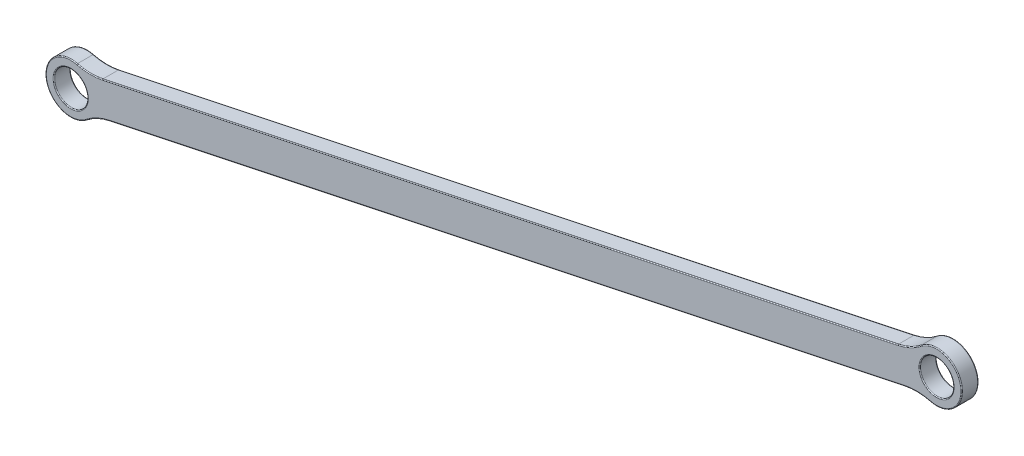
ISO-10303-21;
HEADER;
FILE_DESCRIPTION(('STEP AP214'),'2;1');
FILE_NAME('part.step','',(''),(''),'','','');
FILE_SCHEMA(('AUTOMOTIVE_DESIGN { 1 0 10303 214 1 1 1 1 }'));
ENDSEC;
DATA;
#1=APPLICATION_CONTEXT('core data for automotive mechanical design processes');
#2=APPLICATION_PROTOCOL_DEFINITION('international standard','automotive_design',2000,#1);
#3=PRODUCT_CONTEXT('',#1,'mechanical');
#4=PRODUCT('Part','Part','',(#3));
#5=PRODUCT_RELATED_PRODUCT_CATEGORY('part','',(#4));
#6=PRODUCT_DEFINITION_FORMATION('','',#4);
#7=PRODUCT_DEFINITION_CONTEXT('part definition',#1,'design');
#8=PRODUCT_DEFINITION('design','',#6,#7);
#9=PRODUCT_DEFINITION_SHAPE('','',#8);
#10=(LENGTH_UNIT() NAMED_UNIT(*) SI_UNIT(.MILLI.,.METRE.));
#11=(NAMED_UNIT(*) PLANE_ANGLE_UNIT() SI_UNIT($,.RADIAN.));
#12=(NAMED_UNIT(*) SI_UNIT($,.STERADIAN.) SOLID_ANGLE_UNIT());
#13=UNCERTAINTY_MEASURE_WITH_UNIT(LENGTH_MEASURE(1.E-05),#10,'distance_accuracy_value','');
#14=(GEOMETRIC_REPRESENTATION_CONTEXT(3) GLOBAL_UNCERTAINTY_ASSIGNED_CONTEXT((#13)) GLOBAL_UNIT_ASSIGNED_CONTEXT((#10,
#11,#12)) REPRESENTATION_CONTEXT('',''));
#15=CARTESIAN_POINT('',(0.,0.,0.));
#16=DIRECTION('',(0.,0.,1.));
#17=DIRECTION('',(1.,0.,0.));
#18=AXIS2_PLACEMENT_3D('',#15,#16,#17);
#19=CARTESIAN_POINT('',(-210.455221734671,197.142632271964,-3.));
#20=DIRECTION('',(0.,0.,1.));
#21=DIRECTION('',(1.,0.,0.));
#22=AXIS2_PLACEMENT_3D('',#19,#20,#21);
#23=CYLINDRICAL_SURFACE('',#22,4.49999999999999);
#24=DIRECTION('',(0.,0.,1.));
#25=VECTOR('',#24,1.);
#26=CARTESIAN_POINT('',(-209.338930800535,201.50197792818,-3.));
#27=LINE('',#26,#25);
#28=CARTESIAN_POINT('',(-209.338930800535,201.50197792818,-0.15));
#29=VERTEX_POINT('',#28);
#30=CARTESIAN_POINT('',(-209.338930800535,201.50197792818,-2.85));
#31=VERTEX_POINT('',#30);
#32=EDGE_CURVE('E306',#29,#31,#27,.F.);
#33=ORIENTED_EDGE('',*,*,#32,.T.);
#34=CARTESIAN_POINT('',(-210.455221734671,197.142632271964,-2.85));
#35=DIRECTION('',(0.,0.,1.));
#36=DIRECTION('',(1.,0.,0.));
#37=AXIS2_PLACEMENT_3D('',#34,#35,#36);
#38=CIRCLE('',#37,4.49999999999999);
#39=CARTESIAN_POINT('',(-207.671143978915,193.607252370185,-2.85));
#40=VERTEX_POINT('',#39);
#41=EDGE_CURVE('E221',#31,#40,#38,.T.);
#42=ORIENTED_EDGE('',*,*,#41,.T.);
#43=DIRECTION('',(0.,0.,1.));
#44=VECTOR('',#43,1.);
#45=CARTESIAN_POINT('',(-207.671143978915,193.607252370185,-3.));
#46=LINE('',#45,#44);
#47=CARTESIAN_POINT('',(-207.671143978915,193.607252370185,-0.15));
#48=VERTEX_POINT('',#47);
#49=EDGE_CURVE('E300',#40,#48,#46,.T.);
#50=ORIENTED_EDGE('',*,*,#49,.T.);
#51=CARTESIAN_POINT('',(-210.455221734671,197.142632271964,-0.15));
#52=DIRECTION('',(0.,0.,1.));
#53=DIRECTION('',(1.,0.,0.));
#54=AXIS2_PLACEMENT_3D('',#51,#52,#53);
#55=CIRCLE('',#54,4.49999999999999);
#56=EDGE_CURVE('E219',#48,#29,#55,.F.);
#57=ORIENTED_EDGE('',*,*,#56,.T.);
#58=EDGE_LOOP('',(#33,#42,#50,#57));
#59=FACE_BOUND('',#58,.T.);
#60=ADVANCED_FACE('F35',(#59),#23,.T.);
#61=CARTESIAN_POINT('',(-49.4788263297098,234.215638198508,-3.));
#62=DIRECTION('',(0.206691529175114,-0.978406158896832,0.));
#63=DIRECTION('',(0.978406158896832,0.206691529175114,0.));
#64=AXIS2_PLACEMENT_3D('',#61,#62,#63);
#65=PLANE('',#64);
#66=DIRECTION('',(0.,0.,1.));
#67=VECTOR('',#66,1.);
#68=CARTESIAN_POINT('',(-62.5965873535892,231.444467902078,-3.));
#69=LINE('',#68,#67);
#70=CARTESIAN_POINT('',(-62.5965873535892,231.444467902078,-0.15));
#71=VERTEX_POINT('',#70);
#72=CARTESIAN_POINT('',(-62.5965873535892,231.444467902078,-2.85));
#73=VERTEX_POINT('',#72);
#74=EDGE_CURVE('E334',#71,#73,#69,.F.);
#75=ORIENTED_EDGE('',*,*,#74,.T.);
#76=DIRECTION('',(0.978406158896832,0.206691529175114,0.));
#77=VECTOR('',#76,1.);
#78=CARTESIAN_POINT('',(-49.4788263297098,234.215638198508,-2.85));
#79=LINE('',#78,#77);
#80=CARTESIAN_POINT('',(-204.791368988482,201.405351130802,-2.85));
#81=VERTEX_POINT('',#80);
#82=EDGE_CURVE('E213',#73,#81,#79,.F.);
#83=ORIENTED_EDGE('',*,*,#82,.T.);
#84=DIRECTION('',(0.,0.,1.));
#85=VECTOR('',#84,1.);
#86=CARTESIAN_POINT('',(-204.791368988482,201.405351130802,-3.));
#87=LINE('',#86,#85);
#88=CARTESIAN_POINT('',(-204.791368988482,201.405351130802,-0.15));
#89=VERTEX_POINT('',#88);
#90=EDGE_CURVE('E337',#81,#89,#87,.T.);
#91=ORIENTED_EDGE('',*,*,#90,.T.);
#92=DIRECTION('',(0.978406158896832,0.206691529175114,0.));
#93=VECTOR('',#92,1.);
#94=CARTESIAN_POINT('',(-62.5965873535892,231.444467902078,-0.15));
#95=LINE('',#94,#93);
#96=EDGE_CURVE('E211',#89,#71,#95,.T.);
#97=ORIENTED_EDGE('',*,*,#96,.T.);
#98=EDGE_LOOP('',(#75,#83,#91,#97));
#99=FACE_BOUND('',#98,.T.);
#100=ADVANCED_FACE('F368',(#99),#65,.F.);
#101=CARTESIAN_POINT('',(-55.6925854323498,229.836749807534,-3.));
#102=DIRECTION('',(0.,0.,1.));
#103=DIRECTION('',(1.,0.,0.));
#104=AXIS2_PLACEMENT_3D('',#101,#102,#103);
#105=CYLINDRICAL_SURFACE('',#104,4.5);
#106=DIRECTION('',(0.,0.,1.));
#107=VECTOR('',#106,1.);
#108=CARTESIAN_POINT('',(-56.8088763664856,225.477404151319,-3.));
#109=LINE('',#108,#107);
#110=CARTESIAN_POINT('',(-56.8088763664856,225.477404151319,-0.15));
#111=VERTEX_POINT('',#110);
#112=CARTESIAN_POINT('',(-56.8088763664856,225.477404151319,-2.85));
#113=VERTEX_POINT('',#112);
#114=EDGE_CURVE('E262',#111,#113,#109,.F.);
#115=ORIENTED_EDGE('',*,*,#114,.T.);
#116=CARTESIAN_POINT('',(-55.6925854323498,229.836749807534,-2.85));
#117=DIRECTION('',(0.,0.,1.));
#118=DIRECTION('',(1.,0.,0.));
#119=AXIS2_PLACEMENT_3D('',#116,#117,#118);
#120=CIRCLE('',#119,4.5);
#121=CARTESIAN_POINT('',(-58.4766631881055,233.372129709314,-2.85));
#122=VERTEX_POINT('',#121);
#123=EDGE_CURVE('E204',#113,#122,#120,.T.);
#124=ORIENTED_EDGE('',*,*,#123,.T.);
#125=DIRECTION('',(0.,0.,1.));
#126=VECTOR('',#125,1.);
#127=CARTESIAN_POINT('',(-58.4766631881055,233.372129709314,-3.));
#128=LINE('',#127,#126);
#129=CARTESIAN_POINT('',(-58.4766631881055,233.372129709314,-0.15));
#130=VERTEX_POINT('',#129);
#131=EDGE_CURVE('E342',#122,#130,#128,.T.);
#132=ORIENTED_EDGE('',*,*,#131,.T.);
#133=CARTESIAN_POINT('',(-55.6925854323498,229.836749807534,-0.15));
#134=DIRECTION('',(0.,0.,1.));
#135=DIRECTION('',(1.,0.,0.));
#136=AXIS2_PLACEMENT_3D('',#133,#134,#135);
#137=CIRCLE('',#136,4.5);
#138=EDGE_CURVE('E202',#130,#111,#137,.F.);
#139=ORIENTED_EDGE('',*,*,#138,.T.);
#140=EDGE_LOOP('',(#115,#124,#132,#139));
#141=FACE_BOUND('',#140,.T.);
#142=ADVANCED_FACE('F349',(#141),#105,.T.);
#143=CARTESIAN_POINT('',(-48.2386771546591,228.345201245127,-3.));
#144=DIRECTION('',(0.206691529175114,-0.978406158896832,0.));
#145=DIRECTION('',(0.978406158896832,0.206691529175114,0.));
#146=AXIS2_PLACEMENT_3D('',#143,#144,#145);
#147=PLANE('',#146);
#148=DIRECTION('',(0.,0.,-1.));
#149=VECTOR('',#148,1.);
#150=CARTESIAN_POINT('',(-203.551219813431,195.534914177421,-3.));
#151=LINE('',#150,#149);
#152=CARTESIAN_POINT('',(-203.551219813431,195.534914177421,-0.15));
#153=VERTEX_POINT('',#152);
#154=CARTESIAN_POINT('',(-203.551219813431,195.534914177421,-2.85));
#155=VERTEX_POINT('',#154);
#156=EDGE_CURVE('E302',#153,#155,#151,.T.);
#157=ORIENTED_EDGE('',*,*,#156,.T.);
#158=DIRECTION('',(0.978406158896832,0.206691529175114,0.));
#159=VECTOR('',#158,1.);
#160=CARTESIAN_POINT('',(-61.3564381785385,225.574030948697,-2.85));
#161=LINE('',#160,#159);
#162=CARTESIAN_POINT('',(-61.3564381785385,225.574030948697,-2.85));
#163=VERTEX_POINT('',#162);
#164=EDGE_CURVE('E196',#155,#163,#161,.T.);
#165=ORIENTED_EDGE('',*,*,#164,.T.);
#166=DIRECTION('',(0.,0.,-1.));
#167=VECTOR('',#166,1.);
#168=CARTESIAN_POINT('',(-61.3564381785385,225.574030948697,0.));
#169=LINE('',#168,#167);
#170=CARTESIAN_POINT('',(-61.3564381785385,225.574030948697,-0.15));
#171=VERTEX_POINT('',#170);
#172=EDGE_CURVE('E310',#163,#171,#169,.F.);
#173=ORIENTED_EDGE('',*,*,#172,.T.);
#174=DIRECTION('',(0.978406158896832,0.206691529175114,0.));
#175=VECTOR('',#174,1.);
#176=CARTESIAN_POINT('',(-48.2386771546591,228.345201245127,-0.15));
#177=LINE('',#176,#175);
#178=EDGE_CURVE('E194',#171,#153,#177,.F.);
#179=ORIENTED_EDGE('',*,*,#178,.T.);
#180=EDGE_LOOP('',(#157,#165,#173,#179));
#181=FACE_BOUND('',#180,.T.);
#182=ADVANCED_FACE('F333',(#181),#147,.T.);
#183=CARTESIAN_POINT('',(-55.6925854323498,229.836749807534,-3.));
#184=DIRECTION('',(0.,0.,1.));
#185=DIRECTION('',(1.,0.,0.));
#186=AXIS2_PLACEMENT_3D('',#183,#184,#185);
#187=CYLINDRICAL_SURFACE('',#186,3.00000000000002);
#188=CARTESIAN_POINT('',(-55.6925854323498,229.836749807534,-2.85));
#189=DIRECTION('',(0.,0.,1.));
#190=DIRECTION('',(1.,0.,0.));
#191=AXIS2_PLACEMENT_3D('',#188,#189,#190);
#192=CIRCLE('',#191,3.00000000000002);
#193=CARTESIAN_POINT('',(-52.6925854323498,229.836749807534,-2.85));
#194=VERTEX_POINT('',#193);
#195=EDGE_CURVE('E226',#194,#194,#192,.F.);
#196=ORIENTED_EDGE('',*,*,#195,.T.);
#197=EDGE_LOOP('',(#196));
#198=FACE_BOUND('',#197,.T.);
#199=CARTESIAN_POINT('',(-55.6925854323498,229.836749807534,-0.15));
#200=DIRECTION('',(0.,0.,1.));
#201=DIRECTION('',(1.,0.,0.));
#202=AXIS2_PLACEMENT_3D('',#199,#200,#201);
#203=CIRCLE('',#202,3.00000000000002);
#204=CARTESIAN_POINT('',(-52.6925854323498,229.836749807534,-0.15));
#205=VERTEX_POINT('',#204);
#206=EDGE_CURVE('E223',#205,#205,#203,.T.);
#207=ORIENTED_EDGE('',*,*,#206,.T.);
#208=EDGE_LOOP('',(#207));
#209=FACE_BOUND('',#208,.T.);
#210=ADVANCED_FACE('F403',(#198,#209),#187,.F.);
#211=CARTESIAN_POINT('',(-210.455221734671,197.142632271964,-3.));
#212=DIRECTION('',(0.,0.,1.));
#213=DIRECTION('',(1.,0.,0.));
#214=AXIS2_PLACEMENT_3D('',#211,#212,#213);
#215=CYLINDRICAL_SURFACE('',#214,3.00000000000001);
#216=CARTESIAN_POINT('',(-210.455221734671,197.142632271964,-2.85));
#217=DIRECTION('',(0.,0.,1.));
#218=DIRECTION('',(1.,0.,0.));
#219=AXIS2_PLACEMENT_3D('',#216,#217,#218);
#220=CIRCLE('',#219,3.00000000000001);
#221=CARTESIAN_POINT('',(-207.455221734671,197.142632271964,-2.85));
#222=VERTEX_POINT('',#221);
#223=EDGE_CURVE('E188',#222,#222,#220,.F.);
#224=ORIENTED_EDGE('',*,*,#223,.T.);
#225=EDGE_LOOP('',(#224));
#226=FACE_BOUND('',#225,.T.);
#227=CARTESIAN_POINT('',(-210.455221734671,197.142632271964,-0.15));
#228=DIRECTION('',(0.,0.,1.));
#229=DIRECTION('',(1.,0.,0.));
#230=AXIS2_PLACEMENT_3D('',#227,#228,#229);
#231=CIRCLE('',#230,3.00000000000001);
#232=CARTESIAN_POINT('',(-207.455221734671,197.142632271964,-0.15));
#233=VERTEX_POINT('',#232);
#234=EDGE_CURVE('E180',#233,#233,#231,.T.);
#235=ORIENTED_EDGE('',*,*,#234,.T.);
#236=EDGE_LOOP('',(#235));
#237=FACE_BOUND('',#236,.T.);
#238=ADVANCED_FACE('F405',(#226,#237),#215,.F.);
#239=CARTESIAN_POINT('',(0.,0.,-3.));
#240=DIRECTION('',(0.,0.,1.));
#241=DIRECTION('',(1.,0.,0.));
#242=AXIS2_PLACEMENT_3D('',#239,#240,#241);
#243=PLANE('',#242);
#244=CARTESIAN_POINT('',(-210.455221734671,197.142632271964,-3.));
#245=DIRECTION('',(0.,0.,1.));
#246=DIRECTION('',(1.,0.,0.));
#247=AXIS2_PLACEMENT_3D('',#244,#245,#246);
#248=CIRCLE('',#247,3.15000000000001);
#249=CARTESIAN_POINT('',(-207.305221734671,197.142632271964,-3.));
#250=VERTEX_POINT('',#249);
#251=EDGE_CURVE('E177',#250,#250,#248,.T.);
#252=ORIENTED_EDGE('',*,*,#251,.T.);
#253=EDGE_LOOP('',(#252));
#254=FACE_BOUND('',#253,.T.);
#255=DIRECTION('',(0.978406158896832,0.206691529175114,0.));
#256=VECTOR('',#255,1.);
#257=CARTESIAN_POINT('',(-203.582223542808,195.681675101256,-3.));
#258=LINE('',#257,#256);
#259=CARTESIAN_POINT('',(-61.3874419079148,225.720791872531,-3.));
#260=VERTEX_POINT('',#259);
#261=CARTESIAN_POINT('',(-203.582223542808,195.681675101256,-3.));
#262=VERTEX_POINT('',#261);
#263=EDGE_CURVE('E175',#260,#262,#258,.F.);
#264=ORIENTED_EDGE('',*,*,#263,.T.);
#265=CARTESIAN_POINT('',(-201.48430452168,185.750852588453,-3.));
#266=DIRECTION('',(0.,0.,1.));
#267=DIRECTION('',(1.,0.,0.));
#268=AXIS2_PLACEMENT_3D('',#265,#266,#267);
#269=CIRCLE('',#268,10.15);
#270=CARTESIAN_POINT('',(-207.763946570774,193.725098366911,-3.));
#271=VERTEX_POINT('',#270);
#272=EDGE_CURVE('E155',#262,#271,#269,.T.);
#273=ORIENTED_EDGE('',*,*,#272,.T.);
#274=CARTESIAN_POINT('',(-210.455221734671,197.142632271964,-3.));
#275=DIRECTION('',(0.,0.,1.));
#276=DIRECTION('',(1.,0.,0.));
#277=AXIS2_PLACEMENT_3D('',#274,#275,#276);
#278=CIRCLE('',#277,4.34999999999999);
#279=CARTESIAN_POINT('',(-209.37614049834,201.356666406306,-3.));
#280=VERTEX_POINT('',#279);
#281=EDGE_CURVE('E163',#271,#280,#278,.F.);
#282=ORIENTED_EDGE('',*,*,#281,.T.);
#283=CARTESIAN_POINT('',(-206.858284280233,211.18941271977,-3.));
#284=DIRECTION('',(0.,0.,1.));
#285=DIRECTION('',(1.,0.,0.));
#286=AXIS2_PLACEMENT_3D('',#283,#284,#285);
#287=CIRCLE('',#286,10.15);
#288=CARTESIAN_POINT('',(-204.760365259106,201.258590206967,-3.));
#289=VERTEX_POINT('',#288);
#290=EDGE_CURVE('E169',#280,#289,#287,.T.);
#291=ORIENTED_EDGE('',*,*,#290,.T.);
#292=DIRECTION('',(0.978406158896832,0.206691529175114,0.));
#293=VECTOR('',#292,1.);
#294=CARTESIAN_POINT('',(-49.4478226003336,234.068877274674,-3.));
#295=LINE('',#294,#293);
#296=CARTESIAN_POINT('',(-62.565583624213,231.297706978243,-3.));
#297=VERTEX_POINT('',#296);
#298=EDGE_CURVE('E315',#289,#297,#295,.T.);
#299=ORIENTED_EDGE('',*,*,#298,.T.);
#300=CARTESIAN_POINT('',(-64.6635026453404,241.228529491046,-3.));
#301=DIRECTION('',(0.,0.,1.));
#302=DIRECTION('',(1.,0.,0.));
#303=AXIS2_PLACEMENT_3D('',#300,#301,#302);
#304=CIRCLE('',#303,10.15);
#305=CARTESIAN_POINT('',(-58.383860596247,233.254283712588,-3.));
#306=VERTEX_POINT('',#305);
#307=EDGE_CURVE('E317',#297,#306,#304,.T.);
#308=ORIENTED_EDGE('',*,*,#307,.T.);
#309=CARTESIAN_POINT('',(-55.6925854323498,229.836749807534,-3.));
#310=DIRECTION('',(0.,0.,1.));
#311=DIRECTION('',(1.,0.,0.));
#312=AXIS2_PLACEMENT_3D('',#309,#310,#311);
#313=CIRCLE('',#312,4.35);
#314=CARTESIAN_POINT('',(-56.7716666686811,225.622715673193,-3.));
#315=VERTEX_POINT('',#314);
#316=EDGE_CURVE('E319',#306,#315,#313,.F.);
#317=ORIENTED_EDGE('',*,*,#316,.T.);
#318=CARTESIAN_POINT('',(-59.2895228867874,215.789969359729,-3.));
#319=DIRECTION('',(0.,0.,1.));
#320=DIRECTION('',(1.,0.,0.));
#321=AXIS2_PLACEMENT_3D('',#318,#319,#320);
#322=CIRCLE('',#321,10.15);
#323=EDGE_CURVE('E182',#315,#260,#322,.T.);
#324=ORIENTED_EDGE('',*,*,#323,.T.);
#325=EDGE_LOOP('',(#264,#273,#282,#291,#299,#308,#317,#324));
#326=FACE_BOUND('',#325,.T.);
#327=CARTESIAN_POINT('',(-55.6925854323498,229.836749807534,-3.));
#328=DIRECTION('',(0.,0.,1.));
#329=DIRECTION('',(1.,0.,0.));
#330=AXIS2_PLACEMENT_3D('',#327,#328,#329);
#331=CIRCLE('',#330,3.15000000000002);
#332=CARTESIAN_POINT('',(-52.5425854323498,229.836749807534,-3.));
#333=VERTEX_POINT('',#332);
#334=EDGE_CURVE('E170',#333,#333,#331,.T.);
#335=ORIENTED_EDGE('',*,*,#334,.T.);
#336=EDGE_LOOP('',(#335));
#337=FACE_BOUND('',#336,.T.);
#338=ADVANCED_FACE('F172',(#254,#326,#337),#243,.F.);
#339=CARTESIAN_POINT('',(0.,0.,0.));
#340=DIRECTION('',(0.,0.,1.));
#341=DIRECTION('',(1.,0.,0.));
#342=AXIS2_PLACEMENT_3D('',#339,#340,#341);
#343=PLANE('',#342);
#344=CARTESIAN_POINT('',(-210.455221734671,197.142632271964,0.));
#345=DIRECTION('',(0.,0.,1.));
#346=DIRECTION('',(1.,0.,0.));
#347=AXIS2_PLACEMENT_3D('',#344,#345,#346);
#348=CIRCLE('',#347,3.15000000000001);
#349=CARTESIAN_POINT('',(-207.305221734671,197.142632271964,0.));
#350=VERTEX_POINT('',#349);
#351=EDGE_CURVE('E11',#350,#350,#348,.F.);
#352=ORIENTED_EDGE('',*,*,#351,.T.);
#353=EDGE_LOOP('',(#352));
#354=FACE_BOUND('',#353,.T.);
#355=CARTESIAN_POINT('',(-55.6925854323498,229.836749807534,0.));
#356=DIRECTION('',(0.,0.,1.));
#357=DIRECTION('',(1.,0.,0.));
#358=AXIS2_PLACEMENT_3D('',#355,#356,#357);
#359=CIRCLE('',#358,4.35);
#360=CARTESIAN_POINT('',(-56.7716666686811,225.622715673193,0.));
#361=VERTEX_POINT('',#360);
#362=CARTESIAN_POINT('',(-58.383860596247,233.254283712588,0.));
#363=VERTEX_POINT('',#362);
#364=EDGE_CURVE('E52',#361,#363,#359,.T.);
#365=ORIENTED_EDGE('',*,*,#364,.T.);
#366=CARTESIAN_POINT('',(-64.6635026453404,241.228529491046,0.));
#367=DIRECTION('',(0.,0.,1.));
#368=DIRECTION('',(1.,0.,0.));
#369=AXIS2_PLACEMENT_3D('',#366,#367,#368);
#370=CIRCLE('',#369,10.15);
#371=CARTESIAN_POINT('',(-62.565583624213,231.297706978243,0.));
#372=VERTEX_POINT('',#371);
#373=EDGE_CURVE('E44',#363,#372,#370,.F.);
#374=ORIENTED_EDGE('',*,*,#373,.T.);
#375=DIRECTION('',(0.978406158896832,0.206691529175114,0.));
#376=VECTOR('',#375,1.);
#377=CARTESIAN_POINT('',(-204.760365259106,201.258590206967,0.));
#378=LINE('',#377,#376);
#379=CARTESIAN_POINT('',(-204.760365259106,201.258590206967,0.));
#380=VERTEX_POINT('',#379);
#381=EDGE_CURVE('E232',#372,#380,#378,.F.);
#382=ORIENTED_EDGE('',*,*,#381,.T.);
#383=CARTESIAN_POINT('',(-206.858284280233,211.18941271977,0.));
#384=DIRECTION('',(0.,0.,1.));
#385=DIRECTION('',(1.,0.,0.));
#386=AXIS2_PLACEMENT_3D('',#383,#384,#385);
#387=CIRCLE('',#386,10.15);
#388=CARTESIAN_POINT('',(-209.37614049834,201.356666406306,0.));
#389=VERTEX_POINT('',#388);
#390=EDGE_CURVE('E234',#380,#389,#387,.F.);
#391=ORIENTED_EDGE('',*,*,#390,.T.);
#392=CARTESIAN_POINT('',(-210.455221734671,197.142632271964,0.));
#393=DIRECTION('',(0.,0.,1.));
#394=DIRECTION('',(1.,0.,0.));
#395=AXIS2_PLACEMENT_3D('',#392,#393,#394);
#396=CIRCLE('',#395,4.34999999999999);
#397=CARTESIAN_POINT('',(-207.763946570774,193.725098366911,0.));
#398=VERTEX_POINT('',#397);
#399=EDGE_CURVE('E236',#389,#398,#396,.T.);
#400=ORIENTED_EDGE('',*,*,#399,.T.);
#401=CARTESIAN_POINT('',(-201.48430452168,185.750852588453,0.));
#402=DIRECTION('',(0.,0.,1.));
#403=DIRECTION('',(1.,0.,0.));
#404=AXIS2_PLACEMENT_3D('',#401,#402,#403);
#405=CIRCLE('',#404,10.15);
#406=CARTESIAN_POINT('',(-203.582223542808,195.681675101256,0.));
#407=VERTEX_POINT('',#406);
#408=EDGE_CURVE('E238',#398,#407,#405,.F.);
#409=ORIENTED_EDGE('',*,*,#408,.T.);
#410=DIRECTION('',(0.978406158896832,0.206691529175114,0.));
#411=VECTOR('',#410,1.);
#412=CARTESIAN_POINT('',(-48.2696808840354,228.491962168962,0.));
#413=LINE('',#412,#411);
#414=CARTESIAN_POINT('',(-61.3874419079148,225.720791872531,0.));
#415=VERTEX_POINT('',#414);
#416=EDGE_CURVE('E240',#407,#415,#413,.T.);
#417=ORIENTED_EDGE('',*,*,#416,.T.);
#418=CARTESIAN_POINT('',(-59.2895228867874,215.789969359729,0.));
#419=DIRECTION('',(0.,0.,1.));
#420=DIRECTION('',(1.,0.,0.));
#421=AXIS2_PLACEMENT_3D('',#418,#419,#420);
#422=CIRCLE('',#421,10.15);
#423=EDGE_CURVE('E57',#415,#361,#422,.F.);
#424=ORIENTED_EDGE('',*,*,#423,.T.);
#425=EDGE_LOOP('',(#365,#374,#382,#391,#400,#409,#417,#424));
#426=FACE_BOUND('',#425,.T.);
#427=CARTESIAN_POINT('',(-55.6925854323498,229.836749807534,0.));
#428=DIRECTION('',(0.,0.,1.));
#429=DIRECTION('',(1.,0.,0.));
#430=AXIS2_PLACEMENT_3D('',#427,#428,#429);
#431=CIRCLE('',#430,3.15000000000002);
#432=CARTESIAN_POINT('',(-52.5425854323498,229.836749807534,0.));
#433=VERTEX_POINT('',#432);
#434=EDGE_CURVE('E229',#433,#433,#431,.F.);
#435=ORIENTED_EDGE('',*,*,#434,.T.);
#436=EDGE_LOOP('',(#435));
#437=FACE_BOUND('',#436,.T.);
#438=ADVANCED_FACE('F392',(#354,#426,#437),#343,.T.);
#439=CARTESIAN_POINT('',(-64.6635026453404,241.228529491046,-3.));
#440=DIRECTION('',(0.,0.,1.));
#441=DIRECTION('',(1.,0.,0.));
#442=AXIS2_PLACEMENT_3D('',#439,#440,#441);
#443=CYLINDRICAL_SURFACE('',#442,10.);
#444=ORIENTED_EDGE('',*,*,#131,.F.);
#445=CARTESIAN_POINT('',(-64.6635026453404,241.228529491046,-2.85));
#446=DIRECTION('',(0.,0.,1.));
#447=DIRECTION('',(1.,0.,0.));
#448=AXIS2_PLACEMENT_3D('',#445,#446,#447);
#449=CIRCLE('',#448,10.);
#450=EDGE_CURVE('E209',#122,#73,#449,.F.);
#451=ORIENTED_EDGE('',*,*,#450,.T.);
#452=ORIENTED_EDGE('',*,*,#74,.F.);
#453=CARTESIAN_POINT('',(-64.6635026453404,241.228529491046,-0.15));
#454=DIRECTION('',(0.,0.,1.));
#455=DIRECTION('',(1.,0.,0.));
#456=AXIS2_PLACEMENT_3D('',#453,#454,#455);
#457=CIRCLE('',#456,10.);
#458=EDGE_CURVE('E206',#71,#130,#457,.T.);
#459=ORIENTED_EDGE('',*,*,#458,.T.);
#460=EDGE_LOOP('',(#444,#451,#452,#459));
#461=FACE_BOUND('',#460,.T.);
#462=ADVANCED_FACE('F365',(#461),#443,.F.);
#463=CARTESIAN_POINT('',(-59.2895228867874,215.789969359729,-3.));
#464=DIRECTION('',(0.,0.,1.));
#465=DIRECTION('',(1.,0.,0.));
#466=AXIS2_PLACEMENT_3D('',#463,#464,#465);
#467=CYLINDRICAL_SURFACE('',#466,10.);
#468=ORIENTED_EDGE('',*,*,#172,.F.);
#469=CARTESIAN_POINT('',(-59.2895228867874,215.789969359729,-2.85));
#470=DIRECTION('',(0.,0.,1.));
#471=DIRECTION('',(1.,0.,0.));
#472=AXIS2_PLACEMENT_3D('',#469,#470,#471);
#473=CIRCLE('',#472,10.);
#474=EDGE_CURVE('E200',#163,#113,#473,.F.);
#475=ORIENTED_EDGE('',*,*,#474,.T.);
#476=ORIENTED_EDGE('',*,*,#114,.F.);
#477=CARTESIAN_POINT('',(-59.2895228867874,215.789969359729,-0.15));
#478=DIRECTION('',(0.,0.,1.));
#479=DIRECTION('',(1.,0.,0.));
#480=AXIS2_PLACEMENT_3D('',#477,#478,#479);
#481=CIRCLE('',#480,10.);
#482=EDGE_CURVE('E198',#111,#171,#481,.T.);
#483=ORIENTED_EDGE('',*,*,#482,.T.);
#484=EDGE_LOOP('',(#468,#475,#476,#483));
#485=FACE_BOUND('',#484,.T.);
#486=ADVANCED_FACE('F383',(#485),#467,.F.);
#487=CARTESIAN_POINT('',(-201.48430452168,185.750852588453,-3.));
#488=DIRECTION('',(0.,0.,1.));
#489=DIRECTION('',(1.,0.,0.));
#490=AXIS2_PLACEMENT_3D('',#487,#488,#489);
#491=CYLINDRICAL_SURFACE('',#490,10.);
#492=ORIENTED_EDGE('',*,*,#49,.F.);
#493=CARTESIAN_POINT('',(-201.48430452168,185.750852588453,-2.85));
#494=DIRECTION('',(0.,0.,1.));
#495=DIRECTION('',(1.,0.,0.));
#496=AXIS2_PLACEMENT_3D('',#493,#494,#495);
#497=CIRCLE('',#496,10.);
#498=EDGE_CURVE('E157',#40,#155,#497,.F.);
#499=ORIENTED_EDGE('',*,*,#498,.T.);
#500=ORIENTED_EDGE('',*,*,#156,.F.);
#501=CARTESIAN_POINT('',(-201.48430452168,185.750852588453,-0.15));
#502=DIRECTION('',(0.,0.,1.));
#503=DIRECTION('',(1.,0.,0.));
#504=AXIS2_PLACEMENT_3D('',#501,#502,#503);
#505=CIRCLE('',#504,10.);
#506=EDGE_CURVE('E191',#153,#48,#505,.T.);
#507=ORIENTED_EDGE('',*,*,#506,.T.);
#508=EDGE_LOOP('',(#492,#499,#500,#507));
#509=FACE_BOUND('',#508,.T.);
#510=ADVANCED_FACE('F299',(#509),#491,.F.);
#511=CARTESIAN_POINT('',(-206.858284280233,211.18941271977,-3.));
#512=DIRECTION('',(0.,0.,1.));
#513=DIRECTION('',(1.,0.,0.));
#514=AXIS2_PLACEMENT_3D('',#511,#512,#513);
#515=CYLINDRICAL_SURFACE('',#514,10.);
#516=ORIENTED_EDGE('',*,*,#90,.F.);
#517=CARTESIAN_POINT('',(-206.858284280233,211.18941271977,-2.85));
#518=DIRECTION('',(0.,0.,1.));
#519=DIRECTION('',(1.,0.,0.));
#520=AXIS2_PLACEMENT_3D('',#517,#518,#519);
#521=CIRCLE('',#520,10.);
#522=EDGE_CURVE('E217',#81,#31,#521,.F.);
#523=ORIENTED_EDGE('',*,*,#522,.T.);
#524=ORIENTED_EDGE('',*,*,#32,.F.);
#525=CARTESIAN_POINT('',(-206.858284280233,211.18941271977,-0.15));
#526=DIRECTION('',(0.,0.,1.));
#527=DIRECTION('',(1.,0.,0.));
#528=AXIS2_PLACEMENT_3D('',#525,#526,#527);
#529=CIRCLE('',#528,10.);
#530=EDGE_CURVE('E215',#29,#89,#529,.T.);
#531=ORIENTED_EDGE('',*,*,#530,.T.);
#532=EDGE_LOOP('',(#516,#523,#524,#531));
#533=FACE_BOUND('',#532,.T.);
#534=ADVANCED_FACE('F390',(#533),#515,.F.);
#535=CARTESIAN_POINT('',(-210.455221734671,197.142632271964,-2.85));
#536=DIRECTION('',(0.,0.,1.));
#537=DIRECTION('',(1.,0.,0.));
#538=AXIS2_PLACEMENT_3D('',#535,#536,#537);
#539=TOROIDAL_SURFACE('',#538,3.15000000000001,0.15);
#540=ORIENTED_EDGE('',*,*,#223,.F.);
#541=EDGE_LOOP('',(#540));
#542=FACE_BOUND('',#541,.T.);
#543=ORIENTED_EDGE('',*,*,#251,.F.);
#544=EDGE_LOOP('',(#543));
#545=FACE_BOUND('',#544,.T.);
#546=ADVANCED_FACE('F493',(#542,#545),#539,.T.);
#547=CARTESIAN_POINT('',(-64.6635026453404,241.228529491046,-2.85));
#548=DIRECTION('',(0.,0.,1.));
#549=DIRECTION('',(1.,0.,0.));
#550=AXIS2_PLACEMENT_3D('',#547,#548,#549);
#551=TOROIDAL_SURFACE('',#550,10.15,0.15);
#552=CARTESIAN_POINT('',(-62.565583624213,231.297706978243,-2.85));
#553=DIRECTION('',(-0.978406158896831,-0.206691529175118,0.));
#554=DIRECTION('',(0.206691529175118,-0.978406158896831,0.));
#555=AXIS2_PLACEMENT_3D('',#552,#553,#554);
#556=CIRCLE('',#555,0.15);
#557=EDGE_CURVE('E256',#73,#297,#556,.T.);
#558=ORIENTED_EDGE('',*,*,#557,.F.);
#559=ORIENTED_EDGE('',*,*,#450,.F.);
#560=CARTESIAN_POINT('',(-58.383860596247,233.254283712588,-2.85));
#561=DIRECTION('',(0.785639978173223,0.618683945723483,0.));
#562=DIRECTION('',(-0.618683945723483,0.785639978173223,0.));
#563=AXIS2_PLACEMENT_3D('',#560,#561,#562);
#564=CIRCLE('',#563,0.15);
#565=EDGE_CURVE('E259',#306,#122,#564,.T.);
#566=ORIENTED_EDGE('',*,*,#565,.F.);
#567=ORIENTED_EDGE('',*,*,#307,.F.);
#568=EDGE_LOOP('',(#558,#559,#566,#567));
#569=FACE_BOUND('',#568,.T.);
#570=ADVANCED_FACE('F361',(#569),#551,.T.);
#571=CARTESIAN_POINT('',(-55.6925854323498,229.836749807534,-2.85));
#572=DIRECTION('',(0.,0.,1.));
#573=DIRECTION('',(1.,0.,0.));
#574=AXIS2_PLACEMENT_3D('',#571,#572,#573);
#575=TOROIDAL_SURFACE('',#574,4.35,0.15);
#576=ORIENTED_EDGE('',*,*,#565,.T.);
#577=ORIENTED_EDGE('',*,*,#123,.F.);
#578=CARTESIAN_POINT('',(-56.7716666686811,225.622715673193,-2.85));
#579=DIRECTION('',(-0.968743479159035,0.248064652030166,0.));
#580=DIRECTION('',(-0.248064652030166,-0.968743479159035,0.));
#581=AXIS2_PLACEMENT_3D('',#578,#579,#580);
#582=CIRCLE('',#581,0.15);
#583=EDGE_CURVE('E253',#315,#113,#582,.T.);
#584=ORIENTED_EDGE('',*,*,#583,.F.);
#585=ORIENTED_EDGE('',*,*,#316,.F.);
#586=EDGE_LOOP('',(#576,#577,#584,#585));
#587=FACE_BOUND('',#586,.T.);
#588=ADVANCED_FACE('F355',(#587),#575,.T.);
#589=CARTESIAN_POINT('',(-49.4478226003335,234.068877274674,-2.85));
#590=DIRECTION('',(0.978406158896832,0.206691529175114,0.));
#591=DIRECTION('',(-0.206691529175114,0.978406158896832,0.));
#592=AXIS2_PLACEMENT_3D('',#589,#590,#591);
#593=CYLINDRICAL_SURFACE('',#592,0.15);
#594=ORIENTED_EDGE('',*,*,#557,.T.);
#595=ORIENTED_EDGE('',*,*,#298,.F.);
#596=CARTESIAN_POINT('',(-204.760365259106,201.258590206967,-2.85));
#597=DIRECTION('',(-0.97840615889685,-0.20669152917503,0.));
#598=DIRECTION('',(0.20669152917503,-0.97840615889685,0.));
#599=AXIS2_PLACEMENT_3D('',#596,#597,#598);
#600=CIRCLE('',#599,0.15);
#601=EDGE_CURVE('E250',#81,#289,#600,.T.);
#602=ORIENTED_EDGE('',*,*,#601,.F.);
#603=ORIENTED_EDGE('',*,*,#82,.F.);
#604=EDGE_LOOP('',(#594,#595,#602,#603));
#605=FACE_BOUND('',#604,.T.);
#606=ADVANCED_FACE('F520',(#605),#593,.T.);
#607=CARTESIAN_POINT('',(-59.2895228867874,215.789969359729,-2.85));
#608=DIRECTION('',(0.,0.,1.));
#609=DIRECTION('',(1.,0.,0.));
#610=AXIS2_PLACEMENT_3D('',#607,#608,#609);
#611=TOROIDAL_SURFACE('',#610,10.15,0.15);
#612=ORIENTED_EDGE('',*,*,#583,.T.);
#613=ORIENTED_EDGE('',*,*,#474,.F.);
#614=CARTESIAN_POINT('',(-61.3874419079148,225.720791872531,-2.85));
#615=DIRECTION('',(-0.978406158896823,-0.206691529175156,0.));
#616=DIRECTION('',(0.206691529175156,-0.978406158896823,0.));
#617=AXIS2_PLACEMENT_3D('',#614,#615,#616);
#618=CIRCLE('',#617,0.15);
#619=EDGE_CURVE('E247',#260,#163,#618,.T.);
#620=ORIENTED_EDGE('',*,*,#619,.F.);
#621=ORIENTED_EDGE('',*,*,#323,.F.);
#622=EDGE_LOOP('',(#612,#613,#620,#621));
#623=FACE_BOUND('',#622,.T.);
#624=ADVANCED_FACE('F326',(#623),#611,.T.);
#625=CARTESIAN_POINT('',(-206.858284280233,211.18941271977,-2.85));
#626=DIRECTION('',(0.,0.,1.));
#627=DIRECTION('',(1.,0.,0.));
#628=AXIS2_PLACEMENT_3D('',#625,#626,#627);
#629=TOROIDAL_SURFACE('',#628,10.15,0.15);
#630=ORIENTED_EDGE('',*,*,#601,.T.);
#631=ORIENTED_EDGE('',*,*,#290,.F.);
#632=CARTESIAN_POINT('',(-209.37614049834,201.356666406306,-2.85));
#633=DIRECTION('',(-0.968743479159046,0.248064652030123,0.));
#634=DIRECTION('',(-0.248064652030123,-0.968743479159047,0.));
#635=AXIS2_PLACEMENT_3D('',#632,#633,#634);
#636=CIRCLE('',#635,0.15);
#637=EDGE_CURVE('E166',#31,#280,#636,.T.);
#638=ORIENTED_EDGE('',*,*,#637,.F.);
#639=ORIENTED_EDGE('',*,*,#522,.F.);
#640=EDGE_LOOP('',(#630,#631,#638,#639));
#641=FACE_BOUND('',#640,.T.);
#642=ADVANCED_FACE('F538',(#641),#629,.T.);
#643=CARTESIAN_POINT('',(-48.2696808840354,228.491962168962,-2.85));
#644=DIRECTION('',(-0.978406158896832,-0.206691529175114,0.));
#645=DIRECTION('',(0.206691529175114,-0.978406158896832,0.));
#646=AXIS2_PLACEMENT_3D('',#643,#644,#645);
#647=CYLINDRICAL_SURFACE('',#646,0.15);
#648=ORIENTED_EDGE('',*,*,#619,.T.);
#649=ORIENTED_EDGE('',*,*,#164,.F.);
#650=CARTESIAN_POINT('',(-203.582223542808,195.681675101256,-2.85));
#651=DIRECTION('',(-0.978406158896858,-0.206691529174992,0.));
#652=DIRECTION('',(0.206691529174992,-0.978406158896858,0.));
#653=AXIS2_PLACEMENT_3D('',#650,#651,#652);
#654=CIRCLE('',#653,0.15);
#655=EDGE_CURVE('E160',#262,#155,#654,.T.);
#656=ORIENTED_EDGE('',*,*,#655,.F.);
#657=ORIENTED_EDGE('',*,*,#263,.F.);
#658=EDGE_LOOP('',(#648,#649,#656,#657));
#659=FACE_BOUND('',#658,.T.);
#660=ADVANCED_FACE('F329',(#659),#647,.T.);
#661=CARTESIAN_POINT('',(-210.455221734671,197.142632271964,-2.85));
#662=DIRECTION('',(0.,0.,1.));
#663=DIRECTION('',(1.,0.,0.));
#664=AXIS2_PLACEMENT_3D('',#661,#662,#663);
#665=TOROIDAL_SURFACE('',#664,4.34999999999999,0.15);
#666=ORIENTED_EDGE('',*,*,#637,.T.);
#667=ORIENTED_EDGE('',*,*,#281,.F.);
#668=CARTESIAN_POINT('',(-207.763946570774,193.725098366911,-2.85));
#669=DIRECTION('',(0.785639978173268,0.618683945723426,0.));
#670=DIRECTION('',(-0.618683945723426,0.785639978173268,0.));
#671=AXIS2_PLACEMENT_3D('',#668,#669,#670);
#672=CIRCLE('',#671,0.15);
#673=EDGE_CURVE('E151',#40,#271,#672,.T.);
#674=ORIENTED_EDGE('',*,*,#673,.F.);
#675=ORIENTED_EDGE('',*,*,#41,.F.);
#676=EDGE_LOOP('',(#666,#667,#674,#675));
#677=FACE_BOUND('',#676,.T.);
#678=ADVANCED_FACE('F164',(#677),#665,.T.);
#679=CARTESIAN_POINT('',(-201.48430452168,185.750852588453,-2.85));
#680=DIRECTION('',(0.,0.,1.));
#681=DIRECTION('',(1.,0.,0.));
#682=AXIS2_PLACEMENT_3D('',#679,#680,#681);
#683=TOROIDAL_SURFACE('',#682,10.15,0.15);
#684=ORIENTED_EDGE('',*,*,#655,.T.);
#685=ORIENTED_EDGE('',*,*,#498,.F.);
#686=ORIENTED_EDGE('',*,*,#673,.T.);
#687=ORIENTED_EDGE('',*,*,#272,.F.);
#688=EDGE_LOOP('',(#684,#685,#686,#687));
#689=FACE_BOUND('',#688,.T.);
#690=ADVANCED_FACE('F153',(#689),#683,.T.);
#691=CARTESIAN_POINT('',(-55.6925854323498,229.836749807534,-2.85));
#692=DIRECTION('',(0.,0.,1.));
#693=DIRECTION('',(1.,0.,0.));
#694=AXIS2_PLACEMENT_3D('',#691,#692,#693);
#695=TOROIDAL_SURFACE('',#694,3.15000000000002,0.15);
#696=ORIENTED_EDGE('',*,*,#195,.F.);
#697=EDGE_LOOP('',(#696));
#698=FACE_BOUND('',#697,.T.);
#699=ORIENTED_EDGE('',*,*,#334,.F.);
#700=EDGE_LOOP('',(#699));
#701=FACE_BOUND('',#700,.T.);
#702=ADVANCED_FACE('F572',(#698,#701),#695,.T.);
#703=CARTESIAN_POINT('',(-210.455221734671,197.142632271964,-0.15));
#704=DIRECTION('',(0.,0.,1.));
#705=DIRECTION('',(1.,0.,0.));
#706=AXIS2_PLACEMENT_3D('',#703,#704,#705);
#707=TOROIDAL_SURFACE('',#706,3.15000000000001,0.15);
#708=ORIENTED_EDGE('',*,*,#351,.F.);
#709=EDGE_LOOP('',(#708));
#710=FACE_BOUND('',#709,.T.);
#711=ORIENTED_EDGE('',*,*,#234,.F.);
#712=EDGE_LOOP('',(#711));
#713=FACE_BOUND('',#712,.T.);
#714=ADVANCED_FACE('F581',(#710,#713),#707,.T.);
#715=CARTESIAN_POINT('',(-201.48430452168,185.750852588453,-0.15));
#716=DIRECTION('',(0.,0.,1.));
#717=DIRECTION('',(1.,0.,0.));
#718=AXIS2_PLACEMENT_3D('',#715,#716,#717);
#719=TOROIDAL_SURFACE('',#718,10.15,0.15);
#720=CARTESIAN_POINT('',(-207.763946570774,193.725098366911,-0.15));
#721=DIRECTION('',(-0.785639978173268,-0.618683945723426,0.));
#722=DIRECTION('',(0.618683945723426,-0.785639978173268,0.));
#723=AXIS2_PLACEMENT_3D('',#720,#721,#722);
#724=CIRCLE('',#723,0.15);
#725=EDGE_CURVE('E278',#48,#398,#724,.T.);
#726=ORIENTED_EDGE('',*,*,#725,.F.);
#727=ORIENTED_EDGE('',*,*,#506,.F.);
#728=CARTESIAN_POINT('',(-203.582223542808,195.681675101256,-0.15));
#729=DIRECTION('',(0.97840615889685,0.20669152917503,0.));
#730=DIRECTION('',(-0.20669152917503,0.97840615889685,0.));
#731=AXIS2_PLACEMENT_3D('',#728,#729,#730);
#732=CIRCLE('',#731,0.15);
#733=EDGE_CURVE('E39',#407,#153,#732,.T.);
#734=ORIENTED_EDGE('',*,*,#733,.F.);
#735=ORIENTED_EDGE('',*,*,#408,.F.);
#736=EDGE_LOOP('',(#726,#727,#734,#735));
#737=FACE_BOUND('',#736,.T.);
#738=ADVANCED_FACE('F294',(#737),#719,.T.);
#739=CARTESIAN_POINT('',(-48.2696808840354,228.491962168962,-0.15));
#740=DIRECTION('',(0.978406158896832,0.206691529175114,0.));
#741=DIRECTION('',(-0.206691529175114,0.978406158896832,0.));
#742=AXIS2_PLACEMENT_3D('',#739,#740,#741);
#743=CYLINDRICAL_SURFACE('',#742,0.15);
#744=ORIENTED_EDGE('',*,*,#733,.T.);
#745=ORIENTED_EDGE('',*,*,#178,.F.);
#746=CARTESIAN_POINT('',(-61.3874419079148,225.720791872531,-0.15));
#747=DIRECTION('',(0.97840615889682,0.206691529175169,0.));
#748=DIRECTION('',(-0.206691529175169,0.97840615889682,0.));
#749=AXIS2_PLACEMENT_3D('',#746,#747,#748);
#750=CIRCLE('',#749,0.15);
#751=EDGE_CURVE('E276',#415,#171,#750,.T.);
#752=ORIENTED_EDGE('',*,*,#751,.F.);
#753=ORIENTED_EDGE('',*,*,#416,.F.);
#754=EDGE_LOOP('',(#744,#745,#752,#753));
#755=FACE_BOUND('',#754,.T.);
#756=ADVANCED_FACE('F289',(#755),#743,.T.);
#757=CARTESIAN_POINT('',(-210.455221734671,197.142632271964,-0.15));
#758=DIRECTION('',(0.,0.,1.));
#759=DIRECTION('',(1.,0.,0.));
#760=AXIS2_PLACEMENT_3D('',#757,#758,#759);
#761=TOROIDAL_SURFACE('',#760,4.34999999999999,0.15);
#762=ORIENTED_EDGE('',*,*,#725,.T.);
#763=ORIENTED_EDGE('',*,*,#399,.F.);
#764=CARTESIAN_POINT('',(-209.37614049834,201.356666406306,-0.15));
#765=DIRECTION('',(0.968743479159046,-0.248064652030123,0.));
#766=DIRECTION('',(0.248064652030123,0.968743479159047,0.));
#767=AXIS2_PLACEMENT_3D('',#764,#765,#766);
#768=CIRCLE('',#767,0.15);
#769=EDGE_CURVE('E273',#29,#389,#768,.T.);
#770=ORIENTED_EDGE('',*,*,#769,.F.);
#771=ORIENTED_EDGE('',*,*,#56,.F.);
#772=EDGE_LOOP('',(#762,#763,#770,#771));
#773=FACE_BOUND('',#772,.T.);
#774=ADVANCED_FACE('F607',(#773),#761,.T.);
#775=CARTESIAN_POINT('',(-59.2895228867874,215.789969359729,-0.15));
#776=DIRECTION('',(0.,0.,1.));
#777=DIRECTION('',(1.,0.,0.));
#778=AXIS2_PLACEMENT_3D('',#775,#776,#777);
#779=TOROIDAL_SURFACE('',#778,10.15,0.15);
#780=ORIENTED_EDGE('',*,*,#751,.T.);
#781=ORIENTED_EDGE('',*,*,#482,.F.);
#782=CARTESIAN_POINT('',(-56.7716666686811,225.622715673193,-0.15));
#783=DIRECTION('',(0.968743479159035,-0.248064652030166,0.));
#784=DIRECTION('',(0.248064652030166,0.968743479159036,0.));
#785=AXIS2_PLACEMENT_3D('',#782,#783,#784);
#786=CIRCLE('',#785,0.15);
#787=EDGE_CURVE('E270',#361,#111,#786,.T.);
#788=ORIENTED_EDGE('',*,*,#787,.F.);
#789=ORIENTED_EDGE('',*,*,#423,.F.);
#790=EDGE_LOOP('',(#780,#781,#788,#789));
#791=FACE_BOUND('',#790,.T.);
#792=ADVANCED_FACE('F382',(#791),#779,.T.);
#793=CARTESIAN_POINT('',(-206.858284280233,211.18941271977,-0.15));
#794=DIRECTION('',(0.,0.,1.));
#795=DIRECTION('',(1.,0.,0.));
#796=AXIS2_PLACEMENT_3D('',#793,#794,#795);
#797=TOROIDAL_SURFACE('',#796,10.15,0.15);
#798=ORIENTED_EDGE('',*,*,#769,.T.);
#799=ORIENTED_EDGE('',*,*,#390,.F.);
#800=CARTESIAN_POINT('',(-204.760365259106,201.258590206967,-0.15));
#801=DIRECTION('',(0.97840615889685,0.20669152917503,0.));
#802=DIRECTION('',(-0.20669152917503,0.97840615889685,0.));
#803=AXIS2_PLACEMENT_3D('',#800,#801,#802);
#804=CIRCLE('',#803,0.15);
#805=EDGE_CURVE('E267',#89,#380,#804,.T.);
#806=ORIENTED_EDGE('',*,*,#805,.F.);
#807=ORIENTED_EDGE('',*,*,#530,.F.);
#808=EDGE_LOOP('',(#798,#799,#806,#807));
#809=FACE_BOUND('',#808,.T.);
#810=ADVANCED_FACE('F624',(#809),#797,.T.);
#811=CARTESIAN_POINT('',(-55.6925854323498,229.836749807534,-0.15));
#812=DIRECTION('',(0.,0.,1.));
#813=DIRECTION('',(1.,0.,0.));
#814=AXIS2_PLACEMENT_3D('',#811,#812,#813);
#815=TOROIDAL_SURFACE('',#814,4.35,0.15);
#816=ORIENTED_EDGE('',*,*,#787,.T.);
#817=ORIENTED_EDGE('',*,*,#138,.F.);
#818=CARTESIAN_POINT('',(-58.383860596247,233.254283712588,-0.15));
#819=DIRECTION('',(-0.785639978173223,-0.618683945723483,0.));
#820=DIRECTION('',(0.618683945723483,-0.785639978173223,0.));
#821=AXIS2_PLACEMENT_3D('',#818,#819,#820);
#822=CIRCLE('',#821,0.15);
#823=EDGE_CURVE('E265',#363,#130,#822,.T.);
#824=ORIENTED_EDGE('',*,*,#823,.F.);
#825=ORIENTED_EDGE('',*,*,#364,.F.);
#826=EDGE_LOOP('',(#816,#817,#824,#825));
#827=FACE_BOUND('',#826,.T.);
#828=ADVANCED_FACE('F380',(#827),#815,.T.);
#829=CARTESIAN_POINT('',(-49.4478226003335,234.068877274674,-0.15));
#830=DIRECTION('',(-0.978406158896832,-0.206691529175114,0.));
#831=DIRECTION('',(0.206691529175114,-0.978406158896832,0.));
#832=AXIS2_PLACEMENT_3D('',#829,#830,#831);
#833=CYLINDRICAL_SURFACE('',#832,0.15);
#834=ORIENTED_EDGE('',*,*,#805,.T.);
#835=ORIENTED_EDGE('',*,*,#381,.F.);
#836=CARTESIAN_POINT('',(-62.565583624213,231.297706978243,-0.15));
#837=DIRECTION('',(0.978406158896831,0.206691529175118,0.));
#838=DIRECTION('',(-0.206691529175118,0.978406158896831,0.));
#839=AXIS2_PLACEMENT_3D('',#836,#837,#838);
#840=CIRCLE('',#839,0.15);
#841=EDGE_CURVE('E263',#71,#372,#840,.T.);
#842=ORIENTED_EDGE('',*,*,#841,.F.);
#843=ORIENTED_EDGE('',*,*,#96,.F.);
#844=EDGE_LOOP('',(#834,#835,#842,#843));
#845=FACE_BOUND('',#844,.T.);
#846=ADVANCED_FACE('F374',(#845),#833,.T.);
#847=CARTESIAN_POINT('',(-64.6635026453404,241.228529491046,-0.15));
#848=DIRECTION('',(0.,0.,1.));
#849=DIRECTION('',(1.,0.,0.));
#850=AXIS2_PLACEMENT_3D('',#847,#848,#849);
#851=TOROIDAL_SURFACE('',#850,10.15,0.15);
#852=ORIENTED_EDGE('',*,*,#823,.T.);
#853=ORIENTED_EDGE('',*,*,#458,.F.);
#854=ORIENTED_EDGE('',*,*,#841,.T.);
#855=ORIENTED_EDGE('',*,*,#373,.F.);
#856=EDGE_LOOP('',(#852,#853,#854,#855));
#857=FACE_BOUND('',#856,.T.);
#858=ADVANCED_FACE('F378',(#857),#851,.T.);
#859=CARTESIAN_POINT('',(-55.6925854323498,229.836749807534,-0.15));
#860=DIRECTION('',(0.,0.,1.));
#861=DIRECTION('',(1.,0.,0.));
#862=AXIS2_PLACEMENT_3D('',#859,#860,#861);
#863=TOROIDAL_SURFACE('',#862,3.15000000000002,0.15);
#864=ORIENTED_EDGE('',*,*,#434,.F.);
#865=EDGE_LOOP('',(#864));
#866=FACE_BOUND('',#865,.T.);
#867=ORIENTED_EDGE('',*,*,#206,.F.);
#868=EDGE_LOOP('',(#867));
#869=FACE_BOUND('',#868,.T.);
#870=ADVANCED_FACE('F37',(#866,#869),#863,.T.);
#871=CLOSED_SHELL('',(#60,#100,#142,#182,#210,#238,#338,#438,#462,#486,#510,#534,#546,#570,#588,
#606,#624,#642,#660,#678,#690,#702,#714,#738,#756,#774,#792,#810,#828,#846,#858,#870));
#872=MANIFOLD_SOLID_BREP('B2',#871);
#873=ADVANCED_BREP_SHAPE_REPRESENTATION('',(#18,#872),#14);
#874=SHAPE_DEFINITION_REPRESENTATION(#9,#873);
ENDSEC;
END-ISO-10303-21;
